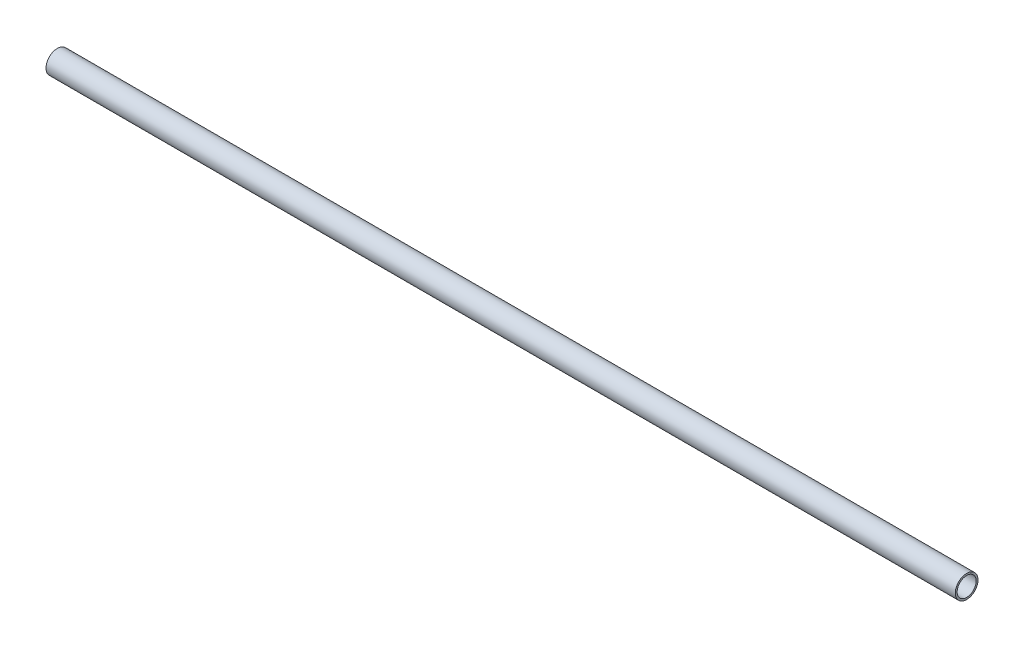
ISO-10303-21;
HEADER;
FILE_DESCRIPTION(('STEP AP214'),'2;1');
FILE_NAME('part.step','',(''),(''),'','','');
FILE_SCHEMA(('AUTOMOTIVE_DESIGN { 1 0 10303 214 1 1 1 1 }'));
ENDSEC;
DATA;
#1=APPLICATION_CONTEXT('core data for automotive mechanical design processes');
#2=APPLICATION_PROTOCOL_DEFINITION('international standard','automotive_design',2000,#1);
#3=PRODUCT_CONTEXT('',#1,'mechanical');
#4=PRODUCT('Part','Part','',(#3));
#5=PRODUCT_RELATED_PRODUCT_CATEGORY('part','',(#4));
#6=PRODUCT_DEFINITION_FORMATION('','',#4);
#7=PRODUCT_DEFINITION_CONTEXT('part definition',#1,'design');
#8=PRODUCT_DEFINITION('design','',#6,#7);
#9=PRODUCT_DEFINITION_SHAPE('','',#8);
#10=(LENGTH_UNIT() NAMED_UNIT(*) SI_UNIT(.MILLI.,.METRE.));
#11=(NAMED_UNIT(*) PLANE_ANGLE_UNIT() SI_UNIT($,.RADIAN.));
#12=(NAMED_UNIT(*) SI_UNIT($,.STERADIAN.) SOLID_ANGLE_UNIT());
#13=UNCERTAINTY_MEASURE_WITH_UNIT(LENGTH_MEASURE(1.E-05),#10,'distance_accuracy_value','');
#14=(GEOMETRIC_REPRESENTATION_CONTEXT(3) GLOBAL_UNCERTAINTY_ASSIGNED_CONTEXT((#13)) GLOBAL_UNIT_ASSIGNED_CONTEXT((#10,
#11,#12)) REPRESENTATION_CONTEXT('',''));
#15=CARTESIAN_POINT('',(0.,0.,0.));
#16=DIRECTION('',(0.,0.,1.));
#17=DIRECTION('',(1.,0.,0.));
#18=AXIS2_PLACEMENT_3D('',#15,#16,#17);
#19=CARTESIAN_POINT('',(1930.4,0.,0.));
#20=DIRECTION('',(1.,0.,0.));
#21=DIRECTION('',(0.,0.,-1.));
#22=AXIS2_PLACEMENT_3D('',#19,#20,#21);
#23=PLANE('',#22);
#24=CARTESIAN_POINT('',(1930.4,0.,0.));
#25=DIRECTION('',(1.,0.,0.));
#26=DIRECTION('',(0.,0.,-1.));
#27=AXIS2_PLACEMENT_3D('',#24,#25,#26);
#28=CIRCLE('',#27,24.13);
#29=CARTESIAN_POINT('',(1930.4,0.,24.13));
#30=VERTEX_POINT('',#29);
#31=EDGE_CURVE('E10',#30,#30,#28,.T.);
#32=ORIENTED_EDGE('',*,*,#31,.T.);
#33=EDGE_LOOP('',(#32));
#34=FACE_BOUND('',#33,.T.);
#35=CARTESIAN_POINT('',(1930.4,0.,0.));
#36=DIRECTION('',(1.,0.,0.));
#37=DIRECTION('',(0.,0.,-1.));
#38=AXIS2_PLACEMENT_3D('',#35,#36,#37);
#39=CIRCLE('',#38,20.193);
#40=CARTESIAN_POINT('',(1930.4,0.,20.193));
#41=VERTEX_POINT('',#40);
#42=EDGE_CURVE('E41',#41,#41,#39,.T.);
#43=ORIENTED_EDGE('',*,*,#42,.F.);
#44=EDGE_LOOP('',(#43));
#45=FACE_BOUND('',#44,.T.);
#46=ADVANCED_FACE('F30',(#34,#45),#23,.T.);
#47=CARTESIAN_POINT('',(0.,0.,0.));
#48=DIRECTION('',(1.,0.,0.));
#49=DIRECTION('',(0.,0.,-1.));
#50=AXIS2_PLACEMENT_3D('',#47,#48,#49);
#51=PLANE('',#50);
#52=CARTESIAN_POINT('',(0.,0.,0.));
#53=DIRECTION('',(1.,0.,0.));
#54=DIRECTION('',(0.,0.,-1.));
#55=AXIS2_PLACEMENT_3D('',#52,#53,#54);
#56=CIRCLE('',#55,24.13);
#57=CARTESIAN_POINT('',(0.,0.,24.13));
#58=VERTEX_POINT('',#57);
#59=EDGE_CURVE('E34',#58,#58,#56,.T.);
#60=ORIENTED_EDGE('',*,*,#59,.F.);
#61=EDGE_LOOP('',(#60));
#62=FACE_BOUND('',#61,.T.);
#63=CARTESIAN_POINT('',(0.,0.,0.));
#64=DIRECTION('',(1.,0.,0.));
#65=DIRECTION('',(0.,0.,-1.));
#66=AXIS2_PLACEMENT_3D('',#63,#64,#65);
#67=CIRCLE('',#66,20.193);
#68=CARTESIAN_POINT('',(0.,0.,20.193));
#69=VERTEX_POINT('',#68);
#70=EDGE_CURVE('E43',#69,#69,#67,.T.);
#71=ORIENTED_EDGE('',*,*,#70,.T.);
#72=EDGE_LOOP('',(#71));
#73=FACE_BOUND('',#72,.T.);
#74=ADVANCED_FACE('F53',(#62,#73),#51,.F.);
#75=CARTESIAN_POINT('',(1930.4,0.,0.));
#76=DIRECTION('',(-1.,0.,0.));
#77=DIRECTION('',(0.,0.,1.));
#78=AXIS2_PLACEMENT_3D('',#75,#76,#77);
#79=CYLINDRICAL_SURFACE('',#78,24.13);
#80=CARTESIAN_POINT('',(1930.4,0.,24.13));
#81=CARTESIAN_POINT('',(1910.29166666667,0.,24.13));
#82=CARTESIAN_POINT('',(1890.18333333333,0.,24.13));
#83=CARTESIAN_POINT('',(1849.96666666667,0.,24.13));
#84=CARTESIAN_POINT('',(1829.85833333333,0.,24.13));
#85=CARTESIAN_POINT('',(1789.64166666667,0.,24.13));
#86=CARTESIAN_POINT('',(1769.53333333333,0.,24.13));
#87=CARTESIAN_POINT('',(1729.31666666667,0.,24.13));
#88=CARTESIAN_POINT('',(1709.20833333333,0.,24.13));
#89=CARTESIAN_POINT('',(1668.99166666667,0.,24.13));
#90=CARTESIAN_POINT('',(1648.88333333333,0.,24.13));
#91=CARTESIAN_POINT('',(1608.66666666667,0.,24.13));
#92=CARTESIAN_POINT('',(1588.55833333333,0.,24.13));
#93=CARTESIAN_POINT('',(1548.34166666667,0.,24.13));
#94=CARTESIAN_POINT('',(1528.23333333333,0.,24.13));
#95=CARTESIAN_POINT('',(1488.01666666667,0.,24.13));
#96=CARTESIAN_POINT('',(1467.90833333333,0.,24.13));
#97=CARTESIAN_POINT('',(1427.69166666667,0.,24.13));
#98=CARTESIAN_POINT('',(1407.58333333333,0.,24.13));
#99=CARTESIAN_POINT('',(1367.36666666667,0.,24.13));
#100=CARTESIAN_POINT('',(1347.25833333333,0.,24.13));
#101=CARTESIAN_POINT('',(1307.04166666667,0.,24.13));
#102=CARTESIAN_POINT('',(1286.93333333333,0.,24.13));
#103=CARTESIAN_POINT('',(1246.71666666667,0.,24.13));
#104=CARTESIAN_POINT('',(1226.60833333333,0.,24.13));
#105=CARTESIAN_POINT('',(1186.39166666667,0.,24.13));
#106=CARTESIAN_POINT('',(1166.28333333333,0.,24.13));
#107=CARTESIAN_POINT('',(1126.06666666667,0.,24.13));
#108=CARTESIAN_POINT('',(1105.95833333333,0.,24.13));
#109=CARTESIAN_POINT('',(1065.74166666667,0.,24.13));
#110=CARTESIAN_POINT('',(1045.63333333333,0.,24.13));
#111=CARTESIAN_POINT('',(1005.41666666667,0.,24.13));
#112=CARTESIAN_POINT('',(985.308333333333,0.,24.13));
#113=CARTESIAN_POINT('',(945.091666666667,0.,24.13));
#114=CARTESIAN_POINT('',(924.983333333333,0.,24.13));
#115=CARTESIAN_POINT('',(884.766666666667,0.,24.13));
#116=CARTESIAN_POINT('',(864.658333333333,0.,24.13));
#117=CARTESIAN_POINT('',(824.441666666667,0.,24.13));
#118=CARTESIAN_POINT('',(804.333333333333,0.,24.13));
#119=CARTESIAN_POINT('',(764.116666666667,0.,24.13));
#120=CARTESIAN_POINT('',(744.008333333333,0.,24.13));
#121=CARTESIAN_POINT('',(703.791666666667,0.,24.13));
#122=CARTESIAN_POINT('',(683.683333333333,0.,24.13));
#123=CARTESIAN_POINT('',(643.466666666667,0.,24.13));
#124=CARTESIAN_POINT('',(623.358333333333,0.,24.13));
#125=CARTESIAN_POINT('',(583.141666666667,0.,24.13));
#126=CARTESIAN_POINT('',(563.033333333333,0.,24.13));
#127=CARTESIAN_POINT('',(522.816666666667,0.,24.13));
#128=CARTESIAN_POINT('',(502.708333333333,0.,24.13));
#129=CARTESIAN_POINT('',(462.491666666667,0.,24.13));
#130=CARTESIAN_POINT('',(442.383333333333,0.,24.13));
#131=CARTESIAN_POINT('',(402.166666666667,0.,24.13));
#132=CARTESIAN_POINT('',(382.058333333333,0.,24.13));
#133=CARTESIAN_POINT('',(341.841666666667,0.,24.13));
#134=CARTESIAN_POINT('',(321.733333333333,0.,24.13));
#135=CARTESIAN_POINT('',(281.516666666667,0.,24.13));
#136=CARTESIAN_POINT('',(261.408333333333,0.,24.13));
#137=CARTESIAN_POINT('',(221.191666666667,0.,24.13));
#138=CARTESIAN_POINT('',(201.083333333333,0.,24.13));
#139=CARTESIAN_POINT('',(160.866666666667,0.,24.13));
#140=CARTESIAN_POINT('',(140.758333333333,0.,24.13));
#141=CARTESIAN_POINT('',(100.541666666667,0.,24.13));
#142=CARTESIAN_POINT('',(80.4333333333333,0.,24.13));
#143=CARTESIAN_POINT('',(40.2166666666666,0.,24.13));
#144=CARTESIAN_POINT('',(20.1083333333333,0.,24.13));
#145=CARTESIAN_POINT('',(0.,0.,24.13));
#146=B_SPLINE_CURVE_WITH_KNOTS('',3,(#80,#81,#82,#83,#84,#85,#86,#87,#88,#89,#90,#91,#92,#93,
#94,#95,#96,#97,#98,#99,#100,#101,#102,#103,#104,#105,#106,#107,#108,#109,#110,#111,#112,#113,
#114,#115,#116,#117,#118,#119,#120,#121,#122,#123,#124,#125,#126,#127,#128,#129,#130,#131,#132,
#133,#134,#135,#136,#137,#138,#139,#140,#141,#142,#143,#144,#145),.UNSPECIFIED.,.F.,.F.,(4,2,2,
2,2,2,2,2,2,2,2,2,2,2,2,2,2,2,2,2,2,2,2,2,2,2,2,2,2,2,2,2,4),(0.,60.325,120.65,180.975,241.3,
301.625,361.95,422.275,482.6,542.925,603.25,663.575,723.9,784.225,844.55,904.875,965.2,1025.525,
1085.85,1146.175,1206.5,1266.825,1327.15,1387.475,1447.8,1508.125,1568.45,1628.775,1689.1,
1749.425,1809.75,1870.075,1930.4),.UNSPECIFIED.);
#147=EDGE_CURVE('BSEAM32',#30,#58,#146,.T.);
#148=ORIENTED_EDGE('',*,*,#31,.F.);
#149=ORIENTED_EDGE('',*,*,#59,.T.);
#150=ORIENTED_EDGE('',*,*,#147,.T.);
#151=ORIENTED_EDGE('',*,*,#147,.F.);
#152=EDGE_LOOP('',(#148,#150,#149,#151));
#153=FACE_BOUND('',#152,.T.);
#154=ADVANCED_FACE('F32',(#153),#79,.T.);
#155=CARTESIAN_POINT('',(1930.4,0.,0.));
#156=DIRECTION('',(-1.,0.,0.));
#157=DIRECTION('',(0.,0.,1.));
#158=AXIS2_PLACEMENT_3D('',#155,#156,#157);
#159=CYLINDRICAL_SURFACE('',#158,20.193);
#160=CARTESIAN_POINT('',(1930.4,0.,20.193));
#161=CARTESIAN_POINT('',(1910.29166666667,0.,20.193));
#162=CARTESIAN_POINT('',(1890.18333333333,0.,20.193));
#163=CARTESIAN_POINT('',(1849.96666666667,0.,20.193));
#164=CARTESIAN_POINT('',(1829.85833333333,0.,20.193));
#165=CARTESIAN_POINT('',(1789.64166666667,0.,20.193));
#166=CARTESIAN_POINT('',(1769.53333333333,0.,20.193));
#167=CARTESIAN_POINT('',(1729.31666666667,0.,20.193));
#168=CARTESIAN_POINT('',(1709.20833333333,0.,20.193));
#169=CARTESIAN_POINT('',(1668.99166666667,0.,20.193));
#170=CARTESIAN_POINT('',(1648.88333333333,0.,20.193));
#171=CARTESIAN_POINT('',(1608.66666666667,0.,20.193));
#172=CARTESIAN_POINT('',(1588.55833333333,0.,20.193));
#173=CARTESIAN_POINT('',(1548.34166666667,0.,20.193));
#174=CARTESIAN_POINT('',(1528.23333333333,0.,20.193));
#175=CARTESIAN_POINT('',(1488.01666666667,0.,20.193));
#176=CARTESIAN_POINT('',(1467.90833333333,0.,20.193));
#177=CARTESIAN_POINT('',(1427.69166666667,0.,20.193));
#178=CARTESIAN_POINT('',(1407.58333333333,0.,20.193));
#179=CARTESIAN_POINT('',(1367.36666666667,0.,20.193));
#180=CARTESIAN_POINT('',(1347.25833333333,0.,20.193));
#181=CARTESIAN_POINT('',(1307.04166666667,0.,20.193));
#182=CARTESIAN_POINT('',(1286.93333333333,0.,20.193));
#183=CARTESIAN_POINT('',(1246.71666666667,0.,20.193));
#184=CARTESIAN_POINT('',(1226.60833333333,0.,20.193));
#185=CARTESIAN_POINT('',(1186.39166666667,0.,20.193));
#186=CARTESIAN_POINT('',(1166.28333333333,0.,20.193));
#187=CARTESIAN_POINT('',(1126.06666666667,0.,20.193));
#188=CARTESIAN_POINT('',(1105.95833333333,0.,20.193));
#189=CARTESIAN_POINT('',(1065.74166666667,0.,20.193));
#190=CARTESIAN_POINT('',(1045.63333333333,0.,20.193));
#191=CARTESIAN_POINT('',(1005.41666666667,0.,20.193));
#192=CARTESIAN_POINT('',(985.308333333333,0.,20.193));
#193=CARTESIAN_POINT('',(945.091666666667,0.,20.193));
#194=CARTESIAN_POINT('',(924.983333333333,0.,20.193));
#195=CARTESIAN_POINT('',(884.766666666667,0.,20.193));
#196=CARTESIAN_POINT('',(864.658333333333,0.,20.193));
#197=CARTESIAN_POINT('',(824.441666666667,0.,20.193));
#198=CARTESIAN_POINT('',(804.333333333333,0.,20.193));
#199=CARTESIAN_POINT('',(764.116666666667,0.,20.193));
#200=CARTESIAN_POINT('',(744.008333333333,0.,20.193));
#201=CARTESIAN_POINT('',(703.791666666667,0.,20.193));
#202=CARTESIAN_POINT('',(683.683333333333,0.,20.193));
#203=CARTESIAN_POINT('',(643.466666666667,0.,20.193));
#204=CARTESIAN_POINT('',(623.358333333333,0.,20.193));
#205=CARTESIAN_POINT('',(583.141666666667,0.,20.193));
#206=CARTESIAN_POINT('',(563.033333333333,0.,20.193));
#207=CARTESIAN_POINT('',(522.816666666667,0.,20.193));
#208=CARTESIAN_POINT('',(502.708333333333,0.,20.193));
#209=CARTESIAN_POINT('',(462.491666666667,0.,20.193));
#210=CARTESIAN_POINT('',(442.383333333333,0.,20.193));
#211=CARTESIAN_POINT('',(402.166666666667,0.,20.193));
#212=CARTESIAN_POINT('',(382.058333333333,0.,20.193));
#213=CARTESIAN_POINT('',(341.841666666667,0.,20.193));
#214=CARTESIAN_POINT('',(321.733333333333,0.,20.193));
#215=CARTESIAN_POINT('',(281.516666666667,0.,20.193));
#216=CARTESIAN_POINT('',(261.408333333333,0.,20.193));
#217=CARTESIAN_POINT('',(221.191666666667,0.,20.193));
#218=CARTESIAN_POINT('',(201.083333333333,0.,20.193));
#219=CARTESIAN_POINT('',(160.866666666667,0.,20.193));
#220=CARTESIAN_POINT('',(140.758333333333,0.,20.193));
#221=CARTESIAN_POINT('',(100.541666666667,0.,20.193));
#222=CARTESIAN_POINT('',(80.4333333333333,0.,20.193));
#223=CARTESIAN_POINT('',(40.2166666666666,0.,20.193));
#224=CARTESIAN_POINT('',(20.1083333333333,0.,20.193));
#225=CARTESIAN_POINT('',(0.,0.,20.193));
#226=B_SPLINE_CURVE_WITH_KNOTS('',3,(#160,#161,#162,#163,#164,#165,#166,#167,#168,#169,#170,
#171,#172,#173,#174,#175,#176,#177,#178,#179,#180,#181,#182,#183,#184,#185,#186,#187,#188,#189,
#190,#191,#192,#193,#194,#195,#196,#197,#198,#199,#200,#201,#202,#203,#204,#205,#206,#207,#208,
#209,#210,#211,#212,#213,#214,#215,#216,#217,#218,#219,#220,#221,#222,#223,#224,#225),
.UNSPECIFIED.,.F.,.F.,(4,2,2,2,2,2,2,2,2,2,2,2,2,2,2,2,2,2,2,2,2,2,2,2,2,2,2,2,2,2,2,2,4),(0.,
60.325,120.65,180.975,241.3,301.625,361.95,422.275,482.6,542.925,603.25,663.575,723.9,784.225,
844.55,904.875,965.2,1025.525,1085.85,1146.175,1206.5,1266.825,1327.15,1387.475,1447.8,1508.125,
1568.45,1628.775,1689.1,1749.425,1809.75,1870.075,1930.4),.UNSPECIFIED.);
#227=EDGE_CURVE('BSEAM49',#41,#69,#226,.T.);
#228=ORIENTED_EDGE('',*,*,#42,.T.);
#229=ORIENTED_EDGE('',*,*,#70,.F.);
#230=ORIENTED_EDGE('',*,*,#227,.T.);
#231=ORIENTED_EDGE('',*,*,#227,.F.);
#232=EDGE_LOOP('',(#228,#230,#229,#231));
#233=FACE_BOUND('',#232,.T.);
#234=ADVANCED_FACE('F49',(#233),#159,.F.);
#235=CLOSED_SHELL('',(#46,#74,#154,#234));
#236=MANIFOLD_SOLID_BREP('B2',#235);
#237=ADVANCED_BREP_SHAPE_REPRESENTATION('',(#18,#236),#14);
#238=SHAPE_DEFINITION_REPRESENTATION(#9,#237);
ENDSEC;
END-ISO-10303-21;
